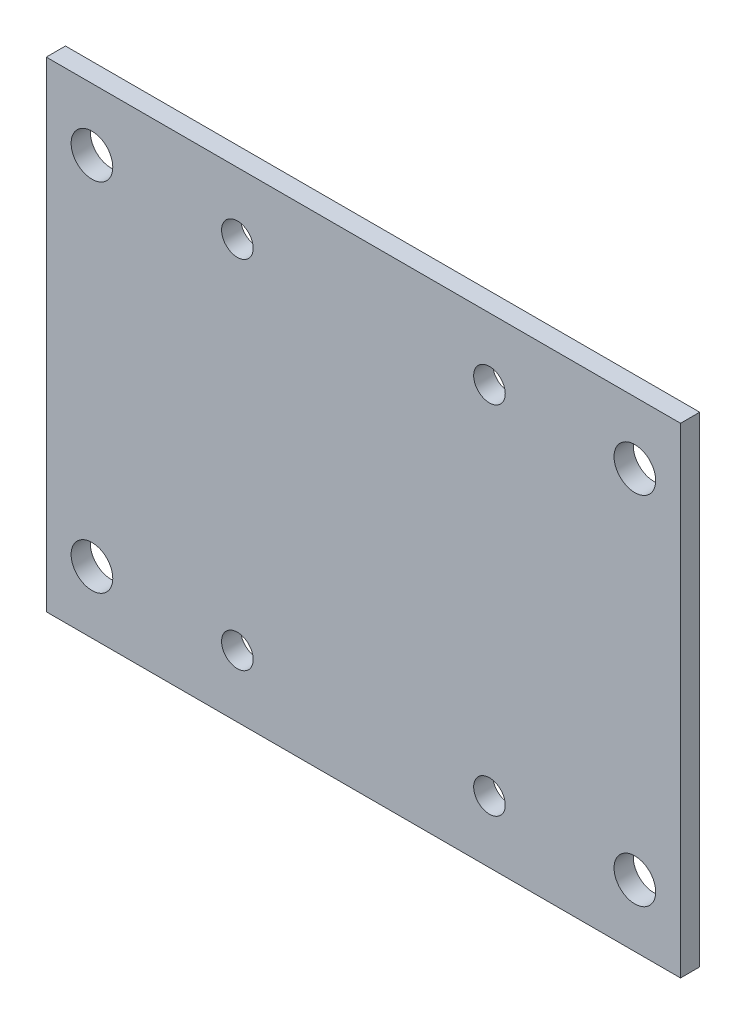
ISO-10303-21;
HEADER;
FILE_DESCRIPTION(('STEP AP214'),'2;1');
FILE_NAME('part.step','',(''),(''),'','','');
FILE_SCHEMA(('AUTOMOTIVE_DESIGN { 1 0 10303 214 1 1 1 1 }'));
ENDSEC;
DATA;
#1=APPLICATION_CONTEXT('core data for automotive mechanical design processes');
#2=APPLICATION_PROTOCOL_DEFINITION('international standard','automotive_design',2000,#1);
#3=PRODUCT_CONTEXT('',#1,'mechanical');
#4=PRODUCT('Part','Part','',(#3));
#5=PRODUCT_RELATED_PRODUCT_CATEGORY('part','',(#4));
#6=PRODUCT_DEFINITION_FORMATION('','',#4);
#7=PRODUCT_DEFINITION_CONTEXT('part definition',#1,'design');
#8=PRODUCT_DEFINITION('design','',#6,#7);
#9=PRODUCT_DEFINITION_SHAPE('','',#8);
#10=(LENGTH_UNIT() NAMED_UNIT(*) SI_UNIT(.MILLI.,.METRE.));
#11=(NAMED_UNIT(*) PLANE_ANGLE_UNIT() SI_UNIT($,.RADIAN.));
#12=(NAMED_UNIT(*) SI_UNIT($,.STERADIAN.) SOLID_ANGLE_UNIT());
#13=UNCERTAINTY_MEASURE_WITH_UNIT(LENGTH_MEASURE(1.E-05),#10,'distance_accuracy_value','');
#14=(GEOMETRIC_REPRESENTATION_CONTEXT(3) GLOBAL_UNCERTAINTY_ASSIGNED_CONTEXT((#13)) GLOBAL_UNIT_ASSIGNED_CONTEXT((#10,
#11,#12)) REPRESENTATION_CONTEXT('',''));
#15=CARTESIAN_POINT('',(0.,0.,0.));
#16=DIRECTION('',(0.,0.,1.));
#17=DIRECTION('',(1.,0.,0.));
#18=AXIS2_PLACEMENT_3D('',#15,#16,#17);
#19=CARTESIAN_POINT('',(-25.4,33.401,0.));
#20=DIRECTION('',(0.,1.,0.));
#21=DIRECTION('',(1.,0.,0.));
#22=AXIS2_PLACEMENT_3D('',#19,#20,#21);
#23=PLANE('',#22);
#24=DIRECTION('',(1.,0.,0.));
#25=VECTOR('',#24,1.);
#26=CARTESIAN_POINT('',(-25.4,33.401,0.));
#27=LINE('',#26,#25);
#28=CARTESIAN_POINT('',(-44.0965904474696,33.401,0.));
#29=VERTEX_POINT('',#28);
#30=CARTESIAN_POINT('',(44.0965904474696,33.401,0.));
#31=VERTEX_POINT('',#30);
#32=EDGE_CURVE('E12',#29,#31,#27,.T.);
#33=ORIENTED_EDGE('',*,*,#32,.T.);
#34=DIRECTION('',(0.,0.,1.));
#35=VECTOR('',#34,1.);
#36=CARTESIAN_POINT('',(44.0965904474696,33.401,0.));
#37=LINE('',#36,#35);
#38=CARTESIAN_POINT('',(44.0965904474696,33.401,-2.66700000000002));
#39=VERTEX_POINT('',#38);
#40=EDGE_CURVE('E106',#39,#31,#37,.T.);
#41=ORIENTED_EDGE('',*,*,#40,.F.);
#42=DIRECTION('',(-1.,0.,0.));
#43=VECTOR('',#42,1.);
#44=CARTESIAN_POINT('',(-25.4,33.401,-2.667));
#45=LINE('',#44,#43);
#46=CARTESIAN_POINT('',(-44.0965904474696,33.401,-2.66699999999999));
#47=VERTEX_POINT('',#46);
#48=EDGE_CURVE('E102',#47,#39,#45,.F.);
#49=ORIENTED_EDGE('',*,*,#48,.F.);
#50=DIRECTION('',(0.,0.,1.));
#51=VECTOR('',#50,1.);
#52=CARTESIAN_POINT('',(-44.0965904474696,33.401,0.));
#53=LINE('',#52,#51);
#54=EDGE_CURVE('E104',#47,#29,#53,.T.);
#55=ORIENTED_EDGE('',*,*,#54,.T.);
#56=EDGE_LOOP('',(#33,#41,#49,#55));
#57=FACE_BOUND('',#56,.T.);
#58=ADVANCED_FACE('F57',(#57),#23,.T.);
#59=CARTESIAN_POINT('',(-25.4,-33.401,0.));
#60=DIRECTION('',(0.,1.,0.));
#61=DIRECTION('',(1.,0.,0.));
#62=AXIS2_PLACEMENT_3D('',#59,#60,#61);
#63=PLANE('',#62);
#64=DIRECTION('',(1.,0.,0.));
#65=VECTOR('',#64,1.);
#66=CARTESIAN_POINT('',(-25.4,-33.401,0.));
#67=LINE('',#66,#65);
#68=CARTESIAN_POINT('',(-44.0965904474696,-33.401,0.));
#69=VERTEX_POINT('',#68);
#70=CARTESIAN_POINT('',(44.0965904474696,-33.401,0.));
#71=VERTEX_POINT('',#70);
#72=EDGE_CURVE('E68',#69,#71,#67,.T.);
#73=ORIENTED_EDGE('',*,*,#72,.F.);
#74=DIRECTION('',(0.,0.,1.));
#75=VECTOR('',#74,1.);
#76=CARTESIAN_POINT('',(-44.0965904474696,-33.401,0.));
#77=LINE('',#76,#75);
#78=CARTESIAN_POINT('',(-44.0965904474696,-33.401,-2.66699999999999));
#79=VERTEX_POINT('',#78);
#80=EDGE_CURVE('E125',#79,#69,#77,.T.);
#81=ORIENTED_EDGE('',*,*,#80,.F.);
#82=DIRECTION('',(-1.,0.,0.));
#83=VECTOR('',#82,1.);
#84=CARTESIAN_POINT('',(-25.4,-33.401,-2.667));
#85=LINE('',#84,#83);
#86=CARTESIAN_POINT('',(44.0965904474696,-33.401,-2.66700000000002));
#87=VERTEX_POINT('',#86);
#88=EDGE_CURVE('E94',#79,#87,#85,.F.);
#89=ORIENTED_EDGE('',*,*,#88,.T.);
#90=DIRECTION('',(0.,0.,1.));
#91=VECTOR('',#90,1.);
#92=CARTESIAN_POINT('',(44.0965904474696,-33.401,0.));
#93=LINE('',#92,#91);
#94=EDGE_CURVE('E142',#87,#71,#93,.T.);
#95=ORIENTED_EDGE('',*,*,#94,.T.);
#96=EDGE_LOOP('',(#73,#81,#89,#95));
#97=FACE_BOUND('',#96,.T.);
#98=ADVANCED_FACE('F218',(#97),#63,.F.);
#99=CARTESIAN_POINT('',(-25.4,33.401,0.));
#100=DIRECTION('',(0.,0.,-1.));
#101=DIRECTION('',(-1.,0.,0.));
#102=AXIS2_PLACEMENT_3D('',#99,#100,#101);
#103=PLANE('',#102);
#104=CARTESIAN_POINT('',(17.526,24.765,0.));
#105=DIRECTION('',(0.,0.,1.));
#106=DIRECTION('',(1.,0.,0.));
#107=AXIS2_PLACEMENT_3D('',#104,#105,#106);
#108=CIRCLE('',#107,2.1971);
#109=CARTESIAN_POINT('',(19.7231,24.765,0.));
#110=VERTEX_POINT('',#109);
#111=EDGE_CURVE('E165',#110,#110,#108,.T.);
#112=ORIENTED_EDGE('',*,*,#111,.F.);
#113=EDGE_LOOP('',(#112));
#114=FACE_BOUND('',#113,.T.);
#115=CARTESIAN_POINT('',(-17.526,-24.765,0.));
#116=DIRECTION('',(0.,0.,1.));
#117=DIRECTION('',(1.,0.,0.));
#118=AXIS2_PLACEMENT_3D('',#115,#116,#117);
#119=CIRCLE('',#118,2.1971);
#120=CARTESIAN_POINT('',(-15.3289,-24.765,0.));
#121=VERTEX_POINT('',#120);
#122=EDGE_CURVE('E166',#121,#121,#119,.T.);
#123=ORIENTED_EDGE('',*,*,#122,.F.);
#124=EDGE_LOOP('',(#123));
#125=FACE_BOUND('',#124,.T.);
#126=CARTESIAN_POINT('',(-17.526,24.765,0.));
#127=DIRECTION('',(0.,0.,1.));
#128=DIRECTION('',(1.,0.,0.));
#129=AXIS2_PLACEMENT_3D('',#126,#127,#128);
#130=CIRCLE('',#129,2.1971);
#131=CARTESIAN_POINT('',(-15.3289,24.765,0.));
#132=VERTEX_POINT('',#131);
#133=EDGE_CURVE('E170',#132,#132,#130,.T.);
#134=ORIENTED_EDGE('',*,*,#133,.F.);
#135=EDGE_LOOP('',(#134));
#136=FACE_BOUND('',#135,.T.);
#137=CARTESIAN_POINT('',(17.526,-24.765,0.));
#138=DIRECTION('',(0.,0.,1.));
#139=DIRECTION('',(1.,0.,0.));
#140=AXIS2_PLACEMENT_3D('',#137,#138,#139);
#141=CIRCLE('',#140,2.1971);
#142=CARTESIAN_POINT('',(19.7231,-24.765,0.));
#143=VERTEX_POINT('',#142);
#144=EDGE_CURVE('E137',#143,#143,#141,.T.);
#145=ORIENTED_EDGE('',*,*,#144,.F.);
#146=EDGE_LOOP('',(#145));
#147=FACE_BOUND('',#146,.T.);
#148=ORIENTED_EDGE('',*,*,#72,.T.);
#149=DIRECTION('',(0.,-1.,0.));
#150=VECTOR('',#149,1.);
#151=CARTESIAN_POINT('',(44.0965904474696,33.401,0.));
#152=LINE('',#151,#150);
#153=EDGE_CURVE('E156',#31,#71,#152,.T.);
#154=ORIENTED_EDGE('',*,*,#153,.F.);
#155=ORIENTED_EDGE('',*,*,#32,.F.);
#156=DIRECTION('',(0.,-1.,0.));
#157=VECTOR('',#156,1.);
#158=CARTESIAN_POINT('',(-44.0965904474696,33.401,0.));
#159=LINE('',#158,#157);
#160=EDGE_CURVE('E117',#29,#69,#159,.T.);
#161=ORIENTED_EDGE('',*,*,#160,.T.);
#162=EDGE_LOOP('',(#148,#154,#155,#161));
#163=FACE_BOUND('',#162,.T.);
#164=CARTESIAN_POINT('',(37.7465904474696,-24.765,0.));
#165=DIRECTION('',(0.,0.,-1.));
#166=DIRECTION('',(-1.,0.,0.));
#167=AXIS2_PLACEMENT_3D('',#164,#165,#166);
#168=CIRCLE('',#167,2.8956);
#169=CARTESIAN_POINT('',(34.8509904474696,-24.765,0.));
#170=VERTEX_POINT('',#169);
#171=EDGE_CURVE('E138',#170,#170,#168,.T.);
#172=ORIENTED_EDGE('',*,*,#171,.T.);
#173=EDGE_LOOP('',(#172));
#174=FACE_BOUND('',#173,.T.);
#175=CARTESIAN_POINT('',(37.7465904474696,24.765,0.));
#176=DIRECTION('',(0.,0.,-1.));
#177=DIRECTION('',(-1.,0.,0.));
#178=AXIS2_PLACEMENT_3D('',#175,#176,#177);
#179=CIRCLE('',#178,2.8956);
#180=CARTESIAN_POINT('',(34.8509904474696,24.765,0.));
#181=VERTEX_POINT('',#180);
#182=EDGE_CURVE('E133',#181,#181,#179,.T.);
#183=ORIENTED_EDGE('',*,*,#182,.T.);
#184=EDGE_LOOP('',(#183));
#185=FACE_BOUND('',#184,.T.);
#186=CARTESIAN_POINT('',(-37.7465904474696,-24.765,0.));
#187=DIRECTION('',(0.,0.,-1.));
#188=DIRECTION('',(-1.,0.,0.));
#189=AXIS2_PLACEMENT_3D('',#186,#187,#188);
#190=CIRCLE('',#189,2.8956);
#191=CARTESIAN_POINT('',(-40.6421904474696,-24.765,0.));
#192=VERTEX_POINT('',#191);
#193=EDGE_CURVE('E119',#192,#192,#190,.T.);
#194=ORIENTED_EDGE('',*,*,#193,.T.);
#195=EDGE_LOOP('',(#194));
#196=FACE_BOUND('',#195,.T.);
#197=CARTESIAN_POINT('',(-37.7465904474696,24.765,0.));
#198=DIRECTION('',(0.,0.,-1.));
#199=DIRECTION('',(-1.,0.,0.));
#200=AXIS2_PLACEMENT_3D('',#197,#198,#199);
#201=CIRCLE('',#200,2.8956);
#202=CARTESIAN_POINT('',(-40.6421904474696,24.765,0.));
#203=VERTEX_POINT('',#202);
#204=EDGE_CURVE('E230',#203,#203,#201,.T.);
#205=ORIENTED_EDGE('',*,*,#204,.T.);
#206=EDGE_LOOP('',(#205));
#207=FACE_BOUND('',#206,.T.);
#208=ADVANCED_FACE('F59',(#114,#125,#136,#147,#163,#174,#185,#196,#207),#103,.F.);
#209=CARTESIAN_POINT('',(-25.4,33.401,-2.667));
#210=DIRECTION('',(0.,0.,-1.));
#211=DIRECTION('',(-1.,0.,0.));
#212=AXIS2_PLACEMENT_3D('',#209,#210,#211);
#213=PLANE('',#212);
#214=CARTESIAN_POINT('',(17.526,24.765,-2.66700000000001));
#215=DIRECTION('',(0.,0.,-1.));
#216=DIRECTION('',(-1.,0.,0.));
#217=AXIS2_PLACEMENT_3D('',#214,#215,#216);
#218=CIRCLE('',#217,2.1971);
#219=CARTESIAN_POINT('',(15.3289,24.765,-2.66700000000001));
#220=VERTEX_POINT('',#219);
#221=EDGE_CURVE('E61',#220,#220,#218,.T.);
#222=ORIENTED_EDGE('',*,*,#221,.F.);
#223=EDGE_LOOP('',(#222));
#224=FACE_BOUND('',#223,.T.);
#225=CARTESIAN_POINT('',(-17.526,-24.765,-2.667));
#226=DIRECTION('',(0.,0.,-1.));
#227=DIRECTION('',(-1.,0.,0.));
#228=AXIS2_PLACEMENT_3D('',#225,#226,#227);
#229=CIRCLE('',#228,2.1971);
#230=CARTESIAN_POINT('',(-19.7231,-24.765,-2.667));
#231=VERTEX_POINT('',#230);
#232=EDGE_CURVE('E188',#231,#231,#229,.T.);
#233=ORIENTED_EDGE('',*,*,#232,.F.);
#234=EDGE_LOOP('',(#233));
#235=FACE_BOUND('',#234,.T.);
#236=CARTESIAN_POINT('',(-17.526,24.765,-2.667));
#237=DIRECTION('',(0.,0.,-1.));
#238=DIRECTION('',(-1.,0.,0.));
#239=AXIS2_PLACEMENT_3D('',#236,#237,#238);
#240=CIRCLE('',#239,2.1971);
#241=CARTESIAN_POINT('',(-19.7231,24.765,-2.667));
#242=VERTEX_POINT('',#241);
#243=EDGE_CURVE('E185',#242,#242,#240,.T.);
#244=ORIENTED_EDGE('',*,*,#243,.F.);
#245=EDGE_LOOP('',(#244));
#246=FACE_BOUND('',#245,.T.);
#247=CARTESIAN_POINT('',(17.526,-24.765,-2.66700000000001));
#248=DIRECTION('',(0.,0.,-1.));
#249=DIRECTION('',(-1.,0.,0.));
#250=AXIS2_PLACEMENT_3D('',#247,#248,#249);
#251=CIRCLE('',#250,2.1971);
#252=CARTESIAN_POINT('',(15.3289,-24.765,-2.66700000000001));
#253=VERTEX_POINT('',#252);
#254=EDGE_CURVE('E177',#253,#253,#251,.T.);
#255=ORIENTED_EDGE('',*,*,#254,.F.);
#256=EDGE_LOOP('',(#255));
#257=FACE_BOUND('',#256,.T.);
#258=ORIENTED_EDGE('',*,*,#88,.F.);
#259=DIRECTION('',(0.,1.,0.));
#260=VECTOR('',#259,1.);
#261=CARTESIAN_POINT('',(-44.0965904474696,33.401,-2.66699999999999));
#262=LINE('',#261,#260);
#263=EDGE_CURVE('E116',#47,#79,#262,.F.);
#264=ORIENTED_EDGE('',*,*,#263,.F.);
#265=ORIENTED_EDGE('',*,*,#48,.T.);
#266=DIRECTION('',(0.,1.,0.));
#267=VECTOR('',#266,1.);
#268=CARTESIAN_POINT('',(44.0965904474696,33.401,-2.66700000000002));
#269=LINE('',#268,#267);
#270=EDGE_CURVE('E145',#39,#87,#269,.F.);
#271=ORIENTED_EDGE('',*,*,#270,.T.);
#272=EDGE_LOOP('',(#258,#264,#265,#271));
#273=FACE_BOUND('',#272,.T.);
#274=CARTESIAN_POINT('',(37.7465904474696,-24.765,-2.66700000000002));
#275=DIRECTION('',(0.,0.,1.));
#276=DIRECTION('',(1.,0.,0.));
#277=AXIS2_PLACEMENT_3D('',#274,#275,#276);
#278=CIRCLE('',#277,2.8956);
#279=CARTESIAN_POINT('',(40.6421904474696,-24.765,-2.66700000000002));
#280=VERTEX_POINT('',#279);
#281=EDGE_CURVE('E152',#280,#280,#278,.T.);
#282=ORIENTED_EDGE('',*,*,#281,.T.);
#283=EDGE_LOOP('',(#282));
#284=FACE_BOUND('',#283,.T.);
#285=CARTESIAN_POINT('',(37.7465904474696,24.765,-2.66700000000002));
#286=DIRECTION('',(0.,0.,1.));
#287=DIRECTION('',(1.,0.,0.));
#288=AXIS2_PLACEMENT_3D('',#285,#286,#287);
#289=CIRCLE('',#288,2.8956);
#290=CARTESIAN_POINT('',(40.6421904474696,24.765,-2.66700000000002));
#291=VERTEX_POINT('',#290);
#292=EDGE_CURVE('E148',#291,#291,#289,.T.);
#293=ORIENTED_EDGE('',*,*,#292,.T.);
#294=EDGE_LOOP('',(#293));
#295=FACE_BOUND('',#294,.T.);
#296=CARTESIAN_POINT('',(-37.7465904474696,-24.765,-2.66700000000001));
#297=DIRECTION('',(0.,0.,1.));
#298=DIRECTION('',(1.,0.,0.));
#299=AXIS2_PLACEMENT_3D('',#296,#297,#298);
#300=CIRCLE('',#299,2.8956);
#301=CARTESIAN_POINT('',(-34.8509904474696,-24.765,-2.66700000000001));
#302=VERTEX_POINT('',#301);
#303=EDGE_CURVE('E129',#302,#302,#300,.T.);
#304=ORIENTED_EDGE('',*,*,#303,.T.);
#305=EDGE_LOOP('',(#304));
#306=FACE_BOUND('',#305,.T.);
#307=CARTESIAN_POINT('',(-37.7465904474696,24.765,-2.66700000000001));
#308=DIRECTION('',(0.,0.,1.));
#309=DIRECTION('',(1.,0.,0.));
#310=AXIS2_PLACEMENT_3D('',#307,#308,#309);
#311=CIRCLE('',#310,2.8956);
#312=CARTESIAN_POINT('',(-34.8509904474696,24.765,-2.66700000000001));
#313=VERTEX_POINT('',#312);
#314=EDGE_CURVE('E120',#313,#313,#311,.T.);
#315=ORIENTED_EDGE('',*,*,#314,.T.);
#316=EDGE_LOOP('',(#315));
#317=FACE_BOUND('',#316,.T.);
#318=ADVANCED_FACE('F122',(#224,#235,#246,#257,#273,#284,#295,#306,#317),#213,.T.);
#319=CARTESIAN_POINT('',(17.526,-24.765,-11.176));
#320=DIRECTION('',(0.,0.,1.));
#321=DIRECTION('',(1.,0.,0.));
#322=AXIS2_PLACEMENT_3D('',#319,#320,#321);
#323=CYLINDRICAL_SURFACE('',#322,2.1971);
#324=ORIENTED_EDGE('',*,*,#254,.T.);
#325=EDGE_LOOP('',(#324));
#326=FACE_BOUND('',#325,.T.);
#327=ORIENTED_EDGE('',*,*,#144,.T.);
#328=EDGE_LOOP('',(#327));
#329=FACE_BOUND('',#328,.T.);
#330=ADVANCED_FACE('F204',(#326,#329),#323,.F.);
#331=CARTESIAN_POINT('',(-17.526,24.765,-11.176));
#332=DIRECTION('',(0.,0.,1.));
#333=DIRECTION('',(1.,0.,0.));
#334=AXIS2_PLACEMENT_3D('',#331,#332,#333);
#335=CYLINDRICAL_SURFACE('',#334,2.1971);
#336=ORIENTED_EDGE('',*,*,#243,.T.);
#337=EDGE_LOOP('',(#336));
#338=FACE_BOUND('',#337,.T.);
#339=ORIENTED_EDGE('',*,*,#133,.T.);
#340=EDGE_LOOP('',(#339));
#341=FACE_BOUND('',#340,.T.);
#342=ADVANCED_FACE('F213',(#338,#341),#335,.F.);
#343=CARTESIAN_POINT('',(-17.526,-24.765,-11.176));
#344=DIRECTION('',(0.,0.,1.));
#345=DIRECTION('',(1.,0.,0.));
#346=AXIS2_PLACEMENT_3D('',#343,#344,#345);
#347=CYLINDRICAL_SURFACE('',#346,2.1971);
#348=ORIENTED_EDGE('',*,*,#232,.T.);
#349=EDGE_LOOP('',(#348));
#350=FACE_BOUND('',#349,.T.);
#351=ORIENTED_EDGE('',*,*,#122,.T.);
#352=EDGE_LOOP('',(#351));
#353=FACE_BOUND('',#352,.T.);
#354=ADVANCED_FACE('F268',(#350,#353),#347,.F.);
#355=CARTESIAN_POINT('',(17.526,24.765,-11.176));
#356=DIRECTION('',(0.,0.,1.));
#357=DIRECTION('',(1.,0.,0.));
#358=AXIS2_PLACEMENT_3D('',#355,#356,#357);
#359=CYLINDRICAL_SURFACE('',#358,2.1971);
#360=ORIENTED_EDGE('',*,*,#221,.T.);
#361=EDGE_LOOP('',(#360));
#362=FACE_BOUND('',#361,.T.);
#363=ORIENTED_EDGE('',*,*,#111,.T.);
#364=EDGE_LOOP('',(#363));
#365=FACE_BOUND('',#364,.T.);
#366=ADVANCED_FACE('F199',(#362,#365),#359,.F.);
#367=CARTESIAN_POINT('',(44.0965904474696,33.401,0.));
#368=DIRECTION('',(1.,0.,0.));
#369=DIRECTION('',(0.,-1.,0.));
#370=AXIS2_PLACEMENT_3D('',#367,#368,#369);
#371=PLANE('',#370);
#372=ORIENTED_EDGE('',*,*,#94,.F.);
#373=ORIENTED_EDGE('',*,*,#270,.F.);
#374=ORIENTED_EDGE('',*,*,#40,.T.);
#375=ORIENTED_EDGE('',*,*,#153,.T.);
#376=EDGE_LOOP('',(#372,#373,#374,#375));
#377=FACE_BOUND('',#376,.T.);
#378=ADVANCED_FACE('F272',(#377),#371,.T.);
#379=CARTESIAN_POINT('',(37.7465904474696,24.765,-2.66700000000002));
#380=DIRECTION('',(0.,0.,1.));
#381=DIRECTION('',(1.,0.,0.));
#382=AXIS2_PLACEMENT_3D('',#379,#380,#381);
#383=CYLINDRICAL_SURFACE('',#382,2.8956);
#384=ORIENTED_EDGE('',*,*,#292,.F.);
#385=EDGE_LOOP('',(#384));
#386=FACE_BOUND('',#385,.T.);
#387=ORIENTED_EDGE('',*,*,#182,.F.);
#388=EDGE_LOOP('',(#387));
#389=FACE_BOUND('',#388,.T.);
#390=ADVANCED_FACE('F278',(#386,#389),#383,.F.);
#391=CARTESIAN_POINT('',(37.7465904474696,-24.765,-2.66700000000002));
#392=DIRECTION('',(0.,0.,1.));
#393=DIRECTION('',(1.,0.,0.));
#394=AXIS2_PLACEMENT_3D('',#391,#392,#393);
#395=CYLINDRICAL_SURFACE('',#394,2.8956);
#396=ORIENTED_EDGE('',*,*,#281,.F.);
#397=EDGE_LOOP('',(#396));
#398=FACE_BOUND('',#397,.T.);
#399=ORIENTED_EDGE('',*,*,#171,.F.);
#400=EDGE_LOOP('',(#399));
#401=FACE_BOUND('',#400,.T.);
#402=ADVANCED_FACE('F275',(#398,#401),#395,.F.);
#403=CARTESIAN_POINT('',(-44.0965904474696,33.401,0.));
#404=DIRECTION('',(1.,0.,0.));
#405=DIRECTION('',(0.,-1.,0.));
#406=AXIS2_PLACEMENT_3D('',#403,#404,#405);
#407=PLANE('',#406);
#408=ORIENTED_EDGE('',*,*,#54,.F.);
#409=ORIENTED_EDGE('',*,*,#263,.T.);
#410=ORIENTED_EDGE('',*,*,#80,.T.);
#411=ORIENTED_EDGE('',*,*,#160,.F.);
#412=EDGE_LOOP('',(#408,#409,#410,#411));
#413=FACE_BOUND('',#412,.T.);
#414=ADVANCED_FACE('F115',(#413),#407,.F.);
#415=CARTESIAN_POINT('',(-37.7465904474696,24.765,-2.66700000000001));
#416=DIRECTION('',(0.,0.,1.));
#417=DIRECTION('',(1.,0.,0.));
#418=AXIS2_PLACEMENT_3D('',#415,#416,#417);
#419=CYLINDRICAL_SURFACE('',#418,2.8956);
#420=ORIENTED_EDGE('',*,*,#314,.F.);
#421=EDGE_LOOP('',(#420));
#422=FACE_BOUND('',#421,.T.);
#423=ORIENTED_EDGE('',*,*,#204,.F.);
#424=EDGE_LOOP('',(#423));
#425=FACE_BOUND('',#424,.T.);
#426=ADVANCED_FACE('F252',(#422,#425),#419,.F.);
#427=CARTESIAN_POINT('',(-37.7465904474696,-24.765,-2.66700000000001));
#428=DIRECTION('',(0.,0.,1.));
#429=DIRECTION('',(1.,0.,0.));
#430=AXIS2_PLACEMENT_3D('',#427,#428,#429);
#431=CYLINDRICAL_SURFACE('',#430,2.8956);
#432=ORIENTED_EDGE('',*,*,#303,.F.);
#433=EDGE_LOOP('',(#432));
#434=FACE_BOUND('',#433,.T.);
#435=ORIENTED_EDGE('',*,*,#193,.F.);
#436=EDGE_LOOP('',(#435));
#437=FACE_BOUND('',#436,.T.);
#438=ADVANCED_FACE('F249',(#434,#437),#431,.F.);
#439=CLOSED_SHELL('',(#58,#98,#208,#318,#330,#342,#354,#366,#378,#390,#402,#414,#426,#438));
#440=MANIFOLD_SOLID_BREP('B2',#439);
#441=ADVANCED_BREP_SHAPE_REPRESENTATION('',(#18,#440),#14);
#442=SHAPE_DEFINITION_REPRESENTATION(#9,#441);
ENDSEC;
END-ISO-10303-21;
